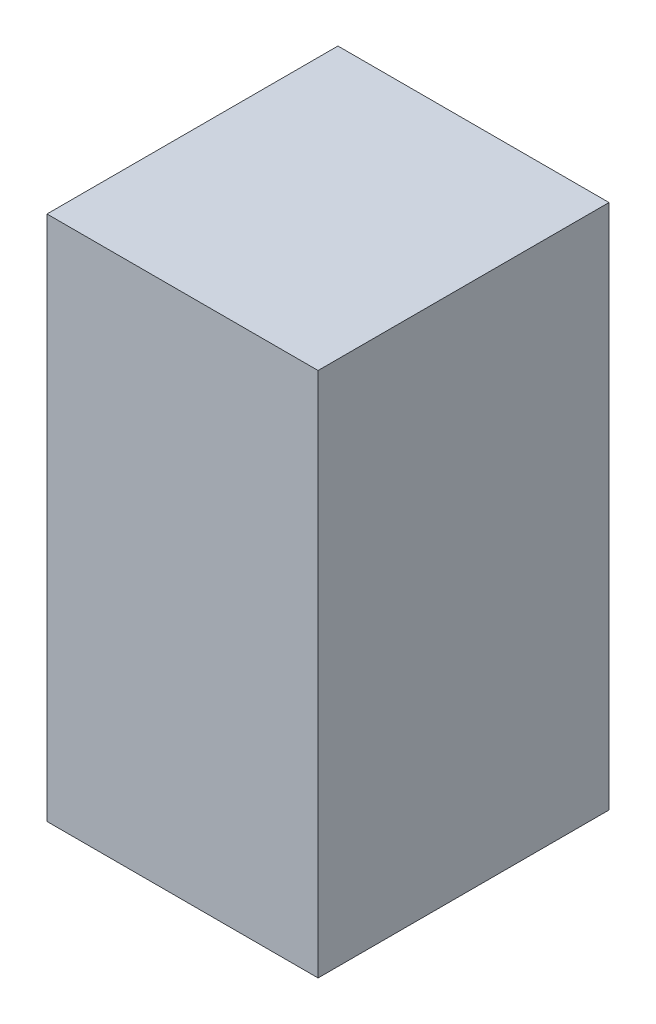
ISO-10303-21;
HEADER;
FILE_DESCRIPTION(('STEP AP214'),'2;1');
FILE_NAME('part.step','',(''),(''),'','','');
FILE_SCHEMA(('AUTOMOTIVE_DESIGN { 1 0 10303 214 1 1 1 1 }'));
ENDSEC;
DATA;
#1=APPLICATION_CONTEXT('core data for automotive mechanical design processes');
#2=APPLICATION_PROTOCOL_DEFINITION('international standard','automotive_design',2000,#1);
#3=PRODUCT_CONTEXT('',#1,'mechanical');
#4=PRODUCT('Part','Part','',(#3));
#5=PRODUCT_RELATED_PRODUCT_CATEGORY('part','',(#4));
#6=PRODUCT_DEFINITION_FORMATION('','',#4);
#7=PRODUCT_DEFINITION_CONTEXT('part definition',#1,'design');
#8=PRODUCT_DEFINITION('design','',#6,#7);
#9=PRODUCT_DEFINITION_SHAPE('','',#8);
#10=(LENGTH_UNIT() NAMED_UNIT(*) SI_UNIT(.MILLI.,.METRE.));
#11=(NAMED_UNIT(*) PLANE_ANGLE_UNIT() SI_UNIT($,.RADIAN.));
#12=(NAMED_UNIT(*) SI_UNIT($,.STERADIAN.) SOLID_ANGLE_UNIT());
#13=UNCERTAINTY_MEASURE_WITH_UNIT(LENGTH_MEASURE(1.E-05),#10,'distance_accuracy_value','');
#14=(GEOMETRIC_REPRESENTATION_CONTEXT(3) GLOBAL_UNCERTAINTY_ASSIGNED_CONTEXT((#13)) GLOBAL_UNIT_ASSIGNED_CONTEXT((#10,
#11,#12)) REPRESENTATION_CONTEXT('',''));
#15=CARTESIAN_POINT('',(0.,0.,0.));
#16=DIRECTION('',(0.,0.,1.));
#17=DIRECTION('',(1.,0.,0.));
#18=AXIS2_PLACEMENT_3D('',#15,#16,#17);
#19=CARTESIAN_POINT('',(0.,469.26,-259.5));
#20=DIRECTION('',(1.,0.,0.));
#21=DIRECTION('',(0.,0.,-1.));
#22=AXIS2_PLACEMENT_3D('',#19,#20,#21);
#23=PLANE('',#22);
#24=DIRECTION('',(0.,0.,1.));
#25=VECTOR('',#24,1.);
#26=CARTESIAN_POINT('',(0.,0.,-259.5));
#27=LINE('',#26,#25);
#28=CARTESIAN_POINT('',(0.,0.,-259.5));
#29=VERTEX_POINT('',#28);
#30=CARTESIAN_POINT('',(0.,0.,0.));
#31=VERTEX_POINT('',#30);
#32=EDGE_CURVE('E107',#29,#31,#27,.T.);
#33=ORIENTED_EDGE('',*,*,#32,.T.);
#34=DIRECTION('',(0.,-1.,0.));
#35=VECTOR('',#34,1.);
#36=CARTESIAN_POINT('',(0.,469.26,0.));
#37=LINE('',#36,#35);
#38=CARTESIAN_POINT('',(0.,469.26,0.));
#39=VERTEX_POINT('',#38);
#40=EDGE_CURVE('E11',#39,#31,#37,.T.);
#41=ORIENTED_EDGE('',*,*,#40,.F.);
#42=DIRECTION('',(0.,0.,1.));
#43=VECTOR('',#42,1.);
#44=CARTESIAN_POINT('',(0.,469.26,-259.5));
#45=LINE('',#44,#43);
#46=CARTESIAN_POINT('',(0.,469.26,-259.5));
#47=VERTEX_POINT('',#46);
#48=EDGE_CURVE('E91',#47,#39,#45,.T.);
#49=ORIENTED_EDGE('',*,*,#48,.F.);
#50=DIRECTION('',(0.,-1.,0.));
#51=VECTOR('',#50,1.);
#52=CARTESIAN_POINT('',(0.,469.26,-259.5));
#53=LINE('',#52,#51);
#54=EDGE_CURVE('E103',#47,#29,#53,.T.);
#55=ORIENTED_EDGE('',*,*,#54,.T.);
#56=EDGE_LOOP('',(#33,#41,#49,#55));
#57=FACE_BOUND('',#56,.T.);
#58=ADVANCED_FACE('F39',(#57),#23,.F.);
#59=CARTESIAN_POINT('',(0.,469.26,0.));
#60=DIRECTION('',(0.,0.,-1.));
#61=DIRECTION('',(-1.,0.,0.));
#62=AXIS2_PLACEMENT_3D('',#59,#60,#61);
#63=PLANE('',#62);
#64=DIRECTION('',(1.,0.,0.));
#65=VECTOR('',#64,1.);
#66=CARTESIAN_POINT('',(0.,0.,0.));
#67=LINE('',#66,#65);
#68=CARTESIAN_POINT('',(241.8,0.,0.));
#69=VERTEX_POINT('',#68);
#70=EDGE_CURVE('E96',#31,#69,#67,.T.);
#71=ORIENTED_EDGE('',*,*,#70,.T.);
#72=DIRECTION('',(0.,-1.,0.));
#73=VECTOR('',#72,1.);
#74=CARTESIAN_POINT('',(241.8,469.26,0.));
#75=LINE('',#74,#73);
#76=CARTESIAN_POINT('',(241.8,469.26,0.));
#77=VERTEX_POINT('',#76);
#78=EDGE_CURVE('E48',#77,#69,#75,.T.);
#79=ORIENTED_EDGE('',*,*,#78,.F.);
#80=DIRECTION('',(1.,0.,0.));
#81=VECTOR('',#80,1.);
#82=CARTESIAN_POINT('',(0.,469.26,0.));
#83=LINE('',#82,#81);
#84=EDGE_CURVE('E86',#39,#77,#83,.T.);
#85=ORIENTED_EDGE('',*,*,#84,.F.);
#86=ORIENTED_EDGE('',*,*,#40,.T.);
#87=EDGE_LOOP('',(#71,#79,#85,#86));
#88=FACE_BOUND('',#87,.T.);
#89=ADVANCED_FACE('F95',(#88),#63,.F.);
#90=CARTESIAN_POINT('',(241.8,469.26,0.));
#91=DIRECTION('',(-1.,0.,0.));
#92=DIRECTION('',(0.,0.,1.));
#93=AXIS2_PLACEMENT_3D('',#90,#91,#92);
#94=PLANE('',#93);
#95=DIRECTION('',(0.,0.,-1.));
#96=VECTOR('',#95,1.);
#97=CARTESIAN_POINT('',(241.8,0.,0.));
#98=LINE('',#97,#96);
#99=CARTESIAN_POINT('',(241.8,0.,-259.5));
#100=VERTEX_POINT('',#99);
#101=EDGE_CURVE('E73',#69,#100,#98,.T.);
#102=ORIENTED_EDGE('',*,*,#101,.T.);
#103=DIRECTION('',(0.,-1.,0.));
#104=VECTOR('',#103,1.);
#105=CARTESIAN_POINT('',(241.8,469.26,-259.5));
#106=LINE('',#105,#104);
#107=CARTESIAN_POINT('',(241.8,469.26,-259.5));
#108=VERTEX_POINT('',#107);
#109=EDGE_CURVE('E98',#108,#100,#106,.T.);
#110=ORIENTED_EDGE('',*,*,#109,.F.);
#111=DIRECTION('',(0.,0.,-1.));
#112=VECTOR('',#111,1.);
#113=CARTESIAN_POINT('',(241.8,469.26,0.));
#114=LINE('',#113,#112);
#115=EDGE_CURVE('E89',#77,#108,#114,.T.);
#116=ORIENTED_EDGE('',*,*,#115,.F.);
#117=ORIENTED_EDGE('',*,*,#78,.T.);
#118=EDGE_LOOP('',(#102,#110,#116,#117));
#119=FACE_BOUND('',#118,.T.);
#120=ADVANCED_FACE('F99',(#119),#94,.F.);
#121=CARTESIAN_POINT('',(241.8,469.26,-259.5));
#122=DIRECTION('',(0.,0.,1.));
#123=DIRECTION('',(1.,0.,0.));
#124=AXIS2_PLACEMENT_3D('',#121,#122,#123);
#125=PLANE('',#124);
#126=DIRECTION('',(-1.,0.,0.));
#127=VECTOR('',#126,1.);
#128=CARTESIAN_POINT('',(241.8,0.,-259.5));
#129=LINE('',#128,#127);
#130=EDGE_CURVE('E79',#100,#29,#129,.T.);
#131=ORIENTED_EDGE('',*,*,#130,.T.);
#132=ORIENTED_EDGE('',*,*,#54,.F.);
#133=DIRECTION('',(-1.,0.,0.));
#134=VECTOR('',#133,1.);
#135=CARTESIAN_POINT('',(241.8,469.26,-259.5));
#136=LINE('',#135,#134);
#137=EDGE_CURVE('E56',#108,#47,#136,.T.);
#138=ORIENTED_EDGE('',*,*,#137,.F.);
#139=ORIENTED_EDGE('',*,*,#109,.T.);
#140=EDGE_LOOP('',(#131,#132,#138,#139));
#141=FACE_BOUND('',#140,.T.);
#142=ADVANCED_FACE('F120',(#141),#125,.F.);
#143=CARTESIAN_POINT('',(0.,469.26,0.));
#144=DIRECTION('',(0.,1.,0.));
#145=DIRECTION('',(0.,0.,1.));
#146=AXIS2_PLACEMENT_3D('',#143,#144,#145);
#147=PLANE('',#146);
#148=ORIENTED_EDGE('',*,*,#48,.T.);
#149=ORIENTED_EDGE('',*,*,#84,.T.);
#150=ORIENTED_EDGE('',*,*,#115,.T.);
#151=ORIENTED_EDGE('',*,*,#137,.T.);
#152=EDGE_LOOP('',(#148,#149,#150,#151));
#153=FACE_BOUND('',#152,.T.);
#154=ADVANCED_FACE('F87',(#153),#147,.T.);
#155=CARTESIAN_POINT('',(0.,0.,0.));
#156=DIRECTION('',(0.,1.,0.));
#157=DIRECTION('',(0.,0.,1.));
#158=AXIS2_PLACEMENT_3D('',#155,#156,#157);
#159=PLANE('',#158);
#160=ORIENTED_EDGE('',*,*,#32,.F.);
#161=ORIENTED_EDGE('',*,*,#130,.F.);
#162=ORIENTED_EDGE('',*,*,#101,.F.);
#163=ORIENTED_EDGE('',*,*,#70,.F.);
#164=EDGE_LOOP('',(#160,#161,#162,#163));
#165=FACE_BOUND('',#164,.T.);
#166=ADVANCED_FACE('F123',(#165),#159,.F.);
#167=CLOSED_SHELL('',(#58,#89,#120,#142,#154,#166));
#168=MANIFOLD_SOLID_BREP('B2',#167);
#169=ADVANCED_BREP_SHAPE_REPRESENTATION('',(#18,#168),#14);
#170=SHAPE_DEFINITION_REPRESENTATION(#9,#169);
ENDSEC;
END-ISO-10303-21;
